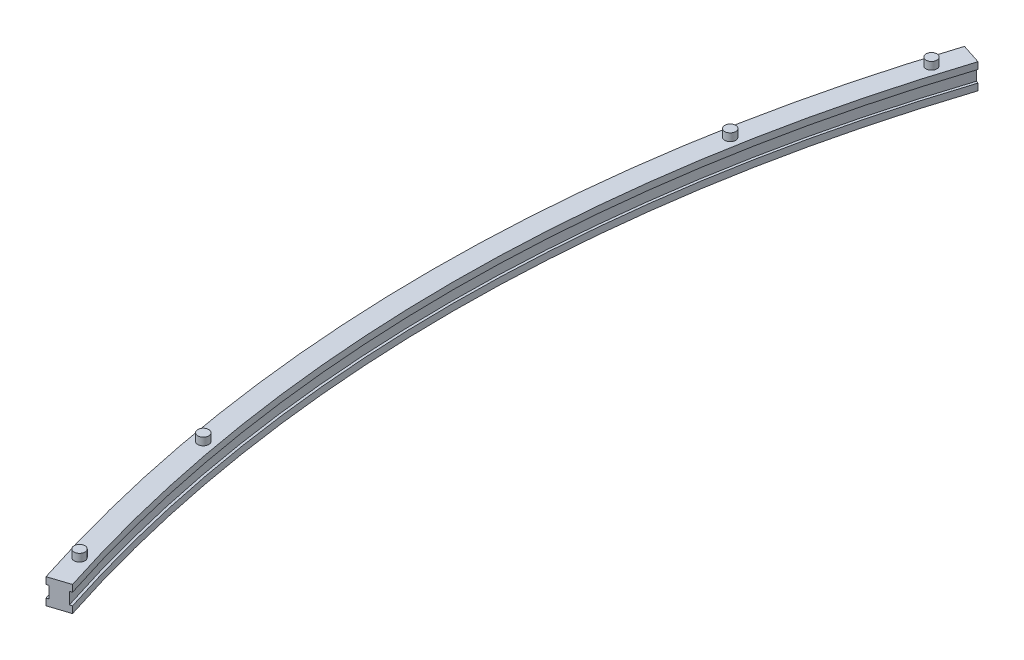
ISO-10303-21;
HEADER;
FILE_DESCRIPTION(('STEP AP214'),'2;1');
FILE_NAME('part.step','',(''),(''),'','','');
FILE_SCHEMA(('AUTOMOTIVE_DESIGN { 1 0 10303 214 1 1 1 1 }'));
ENDSEC;
DATA;
#1=APPLICATION_CONTEXT('core data for automotive mechanical design processes');
#2=APPLICATION_PROTOCOL_DEFINITION('international standard','automotive_design',2000,#1);
#3=PRODUCT_CONTEXT('',#1,'mechanical');
#4=PRODUCT('Part','Part','',(#3));
#5=PRODUCT_RELATED_PRODUCT_CATEGORY('part','',(#4));
#6=PRODUCT_DEFINITION_FORMATION('','',#4);
#7=PRODUCT_DEFINITION_CONTEXT('part definition',#1,'design');
#8=PRODUCT_DEFINITION('design','',#6,#7);
#9=PRODUCT_DEFINITION_SHAPE('','',#8);
#10=(LENGTH_UNIT() NAMED_UNIT(*) SI_UNIT(.MILLI.,.METRE.));
#11=(NAMED_UNIT(*) PLANE_ANGLE_UNIT() SI_UNIT($,.RADIAN.));
#12=(NAMED_UNIT(*) SI_UNIT($,.STERADIAN.) SOLID_ANGLE_UNIT());
#13=UNCERTAINTY_MEASURE_WITH_UNIT(LENGTH_MEASURE(1.E-05),#10,'distance_accuracy_value','');
#14=(GEOMETRIC_REPRESENTATION_CONTEXT(3) GLOBAL_UNCERTAINTY_ASSIGNED_CONTEXT((#13)) GLOBAL_UNIT_ASSIGNED_CONTEXT((#10,
#11,#12)) REPRESENTATION_CONTEXT('',''));
#15=CARTESIAN_POINT('',(0.,0.,0.));
#16=DIRECTION('',(0.,0.,1.));
#17=DIRECTION('',(1.,0.,0.));
#18=AXIS2_PLACEMENT_3D('',#15,#16,#17);
#19=CARTESIAN_POINT('',(0.,0.8,0.));
#20=DIRECTION('',(0.,1.,0.));
#21=DIRECTION('',(0.,0.,1.));
#22=AXIS2_PLACEMENT_3D('',#19,#20,#21);
#23=PLANE('',#22);
#24=CARTESIAN_POINT('',(0.,0.8,0.));
#25=DIRECTION('',(0.,1.,0.));
#26=DIRECTION('',(0.,0.,1.));
#27=AXIS2_PLACEMENT_3D('',#24,#25,#26);
#28=CIRCLE('',#27,176.305859736708);
#29=CARTESIAN_POINT('',(-167.676836763616,0.8,-54.4815068665299));
#30=VERTEX_POINT('',#29);
#31=CARTESIAN_POINT('',(-167.676836763616,0.8,54.4815068665286));
#32=VERTEX_POINT('',#31);
#33=EDGE_CURVE('E152',#30,#32,#28,.T.);
#34=ORIENTED_EDGE('',*,*,#33,.F.);
#35=DIRECTION('',(-0.951056516295151,0.,-0.309016994374955));
#36=VECTOR('',#35,1.);
#37=CARTESIAN_POINT('',(0.,0.8,0.));
#38=LINE('',#37,#36);
#39=CARTESIAN_POINT('',(-167.962153718504,0.8,-54.5742119648424));
#40=VERTEX_POINT('',#39);
#41=EDGE_CURVE('E182',#30,#40,#38,.T.);
#42=ORIENTED_EDGE('',*,*,#41,.T.);
#43=CARTESIAN_POINT('',(0.,0.8,0.));
#44=DIRECTION('',(0.,1.,0.));
#45=DIRECTION('',(0.,0.,1.));
#46=AXIS2_PLACEMENT_3D('',#43,#44,#45);
#47=CIRCLE('',#46,176.605859736708);
#48=CARTESIAN_POINT('',(-167.962153718504,0.8,54.5742119648409));
#49=VERTEX_POINT('',#48);
#50=EDGE_CURVE('E186',#40,#49,#47,.T.);
#51=ORIENTED_EDGE('',*,*,#50,.T.);
#52=DIRECTION('',(-0.951056516295154,0.,0.309016994374947));
#53=VECTOR('',#52,1.);
#54=CARTESIAN_POINT('',(0.,0.8,0.));
#55=LINE('',#54,#53);
#56=EDGE_CURVE('E52',#32,#49,#55,.T.);
#57=ORIENTED_EDGE('',*,*,#56,.F.);
#58=EDGE_LOOP('',(#34,#42,#51,#57));
#59=FACE_BOUND('',#58,.T.);
#60=ADVANCED_FACE('F35',(#59),#23,.T.);
#61=CARTESIAN_POINT('',(0.,0.8,0.));
#62=DIRECTION('',(0.,-1.,0.));
#63=DIRECTION('',(0.,0.,1.));
#64=AXIS2_PLACEMENT_3D('',#61,#62,#63);
#65=CIRCLE('',#64,174.405859736708);
#66=CARTESIAN_POINT('',(-165.869829382655,0.8,53.8943745772162));
#67=VERTEX_POINT('',#66);
#68=CARTESIAN_POINT('',(-165.869829382655,0.8,-53.8943745772176));
#69=VERTEX_POINT('',#68);
#70=EDGE_CURVE('E60',#67,#69,#65,.T.);
#71=ORIENTED_EDGE('',*,*,#70,.F.);
#72=CARTESIAN_POINT('',(-165.584512427766,0.8,53.8016694789036));
#73=VERTEX_POINT('',#72);
#74=EDGE_CURVE('E188',#73,#67,#55,.T.);
#75=ORIENTED_EDGE('',*,*,#74,.F.);
#76=CARTESIAN_POINT('',(0.,0.8,0.));
#77=DIRECTION('',(0.,1.,0.));
#78=DIRECTION('',(0.,0.,1.));
#79=AXIS2_PLACEMENT_3D('',#76,#77,#78);
#80=CIRCLE('',#79,174.105859736708);
#81=CARTESIAN_POINT('',(-165.584512427766,0.8,-53.801669478905));
#82=VERTEX_POINT('',#81);
#83=EDGE_CURVE('E179',#82,#73,#80,.T.);
#84=ORIENTED_EDGE('',*,*,#83,.F.);
#85=EDGE_CURVE('E184',#82,#69,#38,.T.);
#86=ORIENTED_EDGE('',*,*,#85,.T.);
#87=EDGE_LOOP('',(#71,#75,#84,#86));
#88=FACE_BOUND('',#87,.T.);
#89=ADVANCED_FACE('F269',(#88),#23,.T.);
#90=CARTESIAN_POINT('',(0.,0.8,0.));
#91=DIRECTION('',(0.,-1.,0.));
#92=DIRECTION('',(0.,0.,-1.));
#93=AXIS2_PLACEMENT_3D('',#90,#91,#92);
#94=CYLINDRICAL_SURFACE('',#93,174.105859736708);
#95=CARTESIAN_POINT('',(0.,0.,0.));
#96=DIRECTION('',(0.,1.,0.));
#97=DIRECTION('',(0.,0.,1.));
#98=AXIS2_PLACEMENT_3D('',#95,#96,#97);
#99=CIRCLE('',#98,174.105859736708);
#100=CARTESIAN_POINT('',(-165.584512427766,0.,-53.801669478905));
#101=VERTEX_POINT('',#100);
#102=CARTESIAN_POINT('',(-165.584512427766,0.,53.8016694789036));
#103=VERTEX_POINT('',#102);
#104=EDGE_CURVE('E178',#101,#103,#99,.T.);
#105=ORIENTED_EDGE('',*,*,#104,.F.);
#106=DIRECTION('',(0.,-1.,0.));
#107=VECTOR('',#106,1.);
#108=CARTESIAN_POINT('',(-165.584512427766,0.8,-53.801669478905));
#109=LINE('',#108,#107);
#110=EDGE_CURVE('E11',#82,#101,#109,.T.);
#111=ORIENTED_EDGE('',*,*,#110,.F.);
#112=ORIENTED_EDGE('',*,*,#83,.T.);
#113=DIRECTION('',(0.,-1.,0.));
#114=VECTOR('',#113,1.);
#115=CARTESIAN_POINT('',(-165.584512427766,0.8,53.8016694789036));
#116=LINE('',#115,#114);
#117=EDGE_CURVE('E190',#73,#103,#116,.T.);
#118=ORIENTED_EDGE('',*,*,#117,.T.);
#119=EDGE_LOOP('',(#105,#111,#112,#118));
#120=FACE_BOUND('',#119,.T.);
#121=ADVANCED_FACE('F37',(#120),#94,.F.);
#122=CARTESIAN_POINT('',(0.,0.8,0.));
#123=DIRECTION('',(-0.309016994374954,0.,0.951056516295151));
#124=DIRECTION('',(0.951056516295151,0.,0.309016994374954));
#125=AXIS2_PLACEMENT_3D('',#122,#123,#124);
#126=PLANE('',#125);
#127=DIRECTION('',(-0.951056516295151,0.,-0.309016994374955));
#128=VECTOR('',#127,1.);
#129=CARTESIAN_POINT('',(0.,0.,0.));
#130=LINE('',#129,#128);
#131=CARTESIAN_POINT('',(-167.962153718504,0.,-54.5742119648424));
#132=VERTEX_POINT('',#131);
#133=EDGE_CURVE('E193',#101,#132,#130,.T.);
#134=ORIENTED_EDGE('',*,*,#133,.T.);
#135=DIRECTION('',(0.,-1.,0.));
#136=VECTOR('',#135,1.);
#137=CARTESIAN_POINT('',(-167.962153718504,0.8,-54.5742119648424));
#138=LINE('',#137,#136);
#139=EDGE_CURVE('E44',#40,#132,#138,.T.);
#140=ORIENTED_EDGE('',*,*,#139,.F.);
#141=ORIENTED_EDGE('',*,*,#41,.F.);
#142=DIRECTION('',(0.,-1.,0.));
#143=VECTOR('',#142,1.);
#144=CARTESIAN_POINT('',(-167.676836763616,2.2,-54.48150686653));
#145=LINE('',#144,#143);
#146=CARTESIAN_POINT('',(-167.676836763616,2.2,-54.48150686653));
#147=VERTEX_POINT('',#146);
#148=EDGE_CURVE('E165',#147,#30,#145,.T.);
#149=ORIENTED_EDGE('',*,*,#148,.F.);
#150=DIRECTION('',(-0.951056516295152,0.,-0.309016994374953));
#151=VECTOR('',#150,1.);
#152=CARTESIAN_POINT('',(-165.584512427766,2.2,-53.8016694789049));
#153=LINE('',#152,#151);
#154=CARTESIAN_POINT('',(-167.962153718504,2.2,-54.5742119648423));
#155=VERTEX_POINT('',#154);
#156=EDGE_CURVE('E233',#147,#155,#153,.T.);
#157=ORIENTED_EDGE('',*,*,#156,.T.);
#158=DIRECTION('',(0.,-1.,0.));
#159=VECTOR('',#158,1.);
#160=CARTESIAN_POINT('',(-167.962153718504,3.,-54.5742119648423));
#161=LINE('',#160,#159);
#162=CARTESIAN_POINT('',(-167.962153718504,3.,-54.5742119648423));
#163=VERTEX_POINT('',#162);
#164=EDGE_CURVE('E134',#163,#155,#161,.T.);
#165=ORIENTED_EDGE('',*,*,#164,.F.);
#166=DIRECTION('',(-0.951056516295152,0.,-0.309016994374953));
#167=VECTOR('',#166,1.);
#168=CARTESIAN_POINT('',(-165.584512427766,3.,-53.8016694789049));
#169=LINE('',#168,#167);
#170=CARTESIAN_POINT('',(-165.584512427766,3.,-53.8016694789049));
#171=VERTEX_POINT('',#170);
#172=EDGE_CURVE('E126',#171,#163,#169,.T.);
#173=ORIENTED_EDGE('',*,*,#172,.F.);
#174=DIRECTION('',(0.,-1.,0.));
#175=VECTOR('',#174,1.);
#176=CARTESIAN_POINT('',(-165.584512427766,3.,-53.8016694789049));
#177=LINE('',#176,#175);
#178=CARTESIAN_POINT('',(-165.584512427766,2.2,-53.8016694789049));
#179=VERTEX_POINT('',#178);
#180=EDGE_CURVE('E131',#171,#179,#177,.T.);
#181=ORIENTED_EDGE('',*,*,#180,.T.);
#182=CARTESIAN_POINT('',(-165.869829382655,2.2,-53.8943745772175));
#183=VERTEX_POINT('',#182);
#184=EDGE_CURVE('E234',#179,#183,#153,.T.);
#185=ORIENTED_EDGE('',*,*,#184,.T.);
#186=DIRECTION('',(0.,-1.,0.));
#187=VECTOR('',#186,1.);
#188=CARTESIAN_POINT('',(-165.869829382655,2.2,-53.8943745772176));
#189=LINE('',#188,#187);
#190=EDGE_CURVE('E170',#183,#69,#189,.T.);
#191=ORIENTED_EDGE('',*,*,#190,.T.);
#192=ORIENTED_EDGE('',*,*,#85,.F.);
#193=ORIENTED_EDGE('',*,*,#110,.T.);
#194=EDGE_LOOP('',(#134,#140,#141,#149,#157,#165,#173,#181,#185,#191,#192,#193));
#195=FACE_BOUND('',#194,.T.);
#196=ADVANCED_FACE('F128',(#195),#126,.F.);
#197=CARTESIAN_POINT('',(0.,0.8,0.));
#198=DIRECTION('',(0.,-1.,0.));
#199=DIRECTION('',(0.,0.,-1.));
#200=AXIS2_PLACEMENT_3D('',#197,#198,#199);
#201=CYLINDRICAL_SURFACE('',#200,176.605859736708);
#202=CARTESIAN_POINT('',(0.,0.,0.));
#203=DIRECTION('',(0.,1.,0.));
#204=DIRECTION('',(0.,0.,1.));
#205=AXIS2_PLACEMENT_3D('',#202,#203,#204);
#206=CIRCLE('',#205,176.605859736708);
#207=CARTESIAN_POINT('',(-167.962153718504,0.,54.5742119648409));
#208=VERTEX_POINT('',#207);
#209=EDGE_CURVE('E195',#132,#208,#206,.T.);
#210=ORIENTED_EDGE('',*,*,#209,.T.);
#211=DIRECTION('',(0.,-1.,0.));
#212=VECTOR('',#211,1.);
#213=CARTESIAN_POINT('',(-167.962153718504,0.8,54.5742119648409));
#214=LINE('',#213,#212);
#215=EDGE_CURVE('E201',#49,#208,#214,.T.);
#216=ORIENTED_EDGE('',*,*,#215,.F.);
#217=ORIENTED_EDGE('',*,*,#50,.F.);
#218=ORIENTED_EDGE('',*,*,#139,.T.);
#219=EDGE_LOOP('',(#210,#216,#217,#218));
#220=FACE_BOUND('',#219,.T.);
#221=ADVANCED_FACE('F260',(#220),#201,.T.);
#222=CARTESIAN_POINT('',(0.,0.8,0.));
#223=DIRECTION('',(0.309016994374947,0.,0.951056516295154));
#224=DIRECTION('',(0.951056516295154,0.,-0.309016994374947));
#225=AXIS2_PLACEMENT_3D('',#222,#223,#224);
#226=PLANE('',#225);
#227=DIRECTION('',(-0.951056516295154,0.,0.309016994374947));
#228=VECTOR('',#227,1.);
#229=CARTESIAN_POINT('',(0.,0.,0.));
#230=LINE('',#229,#228);
#231=EDGE_CURVE('E183',#103,#208,#230,.T.);
#232=ORIENTED_EDGE('',*,*,#231,.F.);
#233=ORIENTED_EDGE('',*,*,#117,.F.);
#234=ORIENTED_EDGE('',*,*,#74,.T.);
#235=DIRECTION('',(0.,-1.,0.));
#236=VECTOR('',#235,1.);
#237=CARTESIAN_POINT('',(-165.869829382655,2.2,53.8943745772163));
#238=LINE('',#237,#236);
#239=CARTESIAN_POINT('',(-165.869829382655,2.2,53.8943745772163));
#240=VERTEX_POINT('',#239);
#241=EDGE_CURVE('E173',#240,#67,#238,.T.);
#242=ORIENTED_EDGE('',*,*,#241,.F.);
#243=DIRECTION('',(0.951056516295151,0.,-0.309016994374954));
#244=VECTOR('',#243,1.);
#245=CARTESIAN_POINT('',(-167.962153718504,2.2,54.5742119648409));
#246=LINE('',#245,#244);
#247=CARTESIAN_POINT('',(-165.584512427766,2.2,53.8016694789036));
#248=VERTEX_POINT('',#247);
#249=EDGE_CURVE('E238',#240,#248,#246,.T.);
#250=ORIENTED_EDGE('',*,*,#249,.T.);
#251=DIRECTION('',(0.,-1.,0.));
#252=VECTOR('',#251,1.);
#253=CARTESIAN_POINT('',(-165.584512427766,3.,53.8016694789036));
#254=LINE('',#253,#252);
#255=CARTESIAN_POINT('',(-165.584512427766,3.,53.8016694789036));
#256=VERTEX_POINT('',#255);
#257=EDGE_CURVE('E231',#256,#248,#254,.T.);
#258=ORIENTED_EDGE('',*,*,#257,.F.);
#259=DIRECTION('',(0.951056516295151,0.,-0.309016994374954));
#260=VECTOR('',#259,1.);
#261=CARTESIAN_POINT('',(-167.962153718504,3.,54.5742119648409));
#262=LINE('',#261,#260);
#263=CARTESIAN_POINT('',(-167.962153718504,3.,54.574211964841));
#264=VERTEX_POINT('',#263);
#265=EDGE_CURVE('E143',#264,#256,#262,.T.);
#266=ORIENTED_EDGE('',*,*,#265,.F.);
#267=DIRECTION('',(0.,-1.,0.));
#268=VECTOR('',#267,1.);
#269=CARTESIAN_POINT('',(-167.962153718504,3.,54.574211964841));
#270=LINE('',#269,#268);
#271=CARTESIAN_POINT('',(-167.962153718504,2.2,54.574211964841));
#272=VERTEX_POINT('',#271);
#273=EDGE_CURVE('E156',#264,#272,#270,.T.);
#274=ORIENTED_EDGE('',*,*,#273,.T.);
#275=CARTESIAN_POINT('',(-167.676836763616,2.2,54.4815068665285));
#276=VERTEX_POINT('',#275);
#277=EDGE_CURVE('E147',#272,#276,#246,.T.);
#278=ORIENTED_EDGE('',*,*,#277,.T.);
#279=DIRECTION('',(0.,-1.,0.));
#280=VECTOR('',#279,1.);
#281=CARTESIAN_POINT('',(-167.676836763616,2.2,54.4815068665285));
#282=LINE('',#281,#280);
#283=EDGE_CURVE('E176',#276,#32,#282,.T.);
#284=ORIENTED_EDGE('',*,*,#283,.T.);
#285=ORIENTED_EDGE('',*,*,#56,.T.);
#286=ORIENTED_EDGE('',*,*,#215,.T.);
#287=EDGE_LOOP('',(#232,#233,#234,#242,#250,#258,#266,#274,#278,#284,#285,#286));
#288=FACE_BOUND('',#287,.T.);
#289=ADVANCED_FACE('F246',(#288),#226,.T.);
#290=CARTESIAN_POINT('',(0.,0.,0.));
#291=DIRECTION('',(0.,1.,0.));
#292=DIRECTION('',(0.,0.,1.));
#293=AXIS2_PLACEMENT_3D('',#290,#291,#292);
#294=PLANE('',#293);
#295=ORIENTED_EDGE('',*,*,#104,.T.);
#296=ORIENTED_EDGE('',*,*,#231,.T.);
#297=ORIENTED_EDGE('',*,*,#209,.F.);
#298=ORIENTED_EDGE('',*,*,#133,.F.);
#299=EDGE_LOOP('',(#295,#296,#297,#298));
#300=FACE_BOUND('',#299,.T.);
#301=ADVANCED_FACE('F264',(#300),#294,.F.);
#302=CARTESIAN_POINT('',(0.,2.2,0.));
#303=DIRECTION('',(0.,-1.,0.));
#304=DIRECTION('',(0.,0.,-1.));
#305=AXIS2_PLACEMENT_3D('',#302,#303,#304);
#306=CYLINDRICAL_SURFACE('',#305,176.305859736708);
#307=ORIENTED_EDGE('',*,*,#33,.T.);
#308=ORIENTED_EDGE('',*,*,#283,.F.);
#309=CARTESIAN_POINT('',(0.,2.2,0.));
#310=DIRECTION('',(0.,1.,0.));
#311=DIRECTION('',(0.,0.,1.));
#312=AXIS2_PLACEMENT_3D('',#309,#310,#311);
#313=CIRCLE('',#312,176.305859736708);
#314=EDGE_CURVE('E160',#147,#276,#313,.T.);
#315=ORIENTED_EDGE('',*,*,#314,.F.);
#316=ORIENTED_EDGE('',*,*,#148,.T.);
#317=EDGE_LOOP('',(#307,#308,#315,#316));
#318=FACE_BOUND('',#317,.T.);
#319=ADVANCED_FACE('F254',(#318),#306,.T.);
#320=CARTESIAN_POINT('',(0.,2.2,0.));
#321=DIRECTION('',(0.,-1.,0.));
#322=DIRECTION('',(0.,0.,-1.));
#323=AXIS2_PLACEMENT_3D('',#320,#321,#322);
#324=CYLINDRICAL_SURFACE('',#323,174.405859736708);
#325=ORIENTED_EDGE('',*,*,#70,.T.);
#326=ORIENTED_EDGE('',*,*,#190,.F.);
#327=CARTESIAN_POINT('',(0.,2.2,0.));
#328=DIRECTION('',(0.,-1.,0.));
#329=DIRECTION('',(0.,0.,1.));
#330=AXIS2_PLACEMENT_3D('',#327,#328,#329);
#331=CIRCLE('',#330,174.405859736708);
#332=EDGE_CURVE('E163',#240,#183,#331,.T.);
#333=ORIENTED_EDGE('',*,*,#332,.F.);
#334=ORIENTED_EDGE('',*,*,#241,.T.);
#335=EDGE_LOOP('',(#325,#326,#333,#334));
#336=FACE_BOUND('',#335,.T.);
#337=ADVANCED_FACE('F310',(#336),#324,.F.);
#338=CARTESIAN_POINT('',(0.,2.2,0.));
#339=DIRECTION('',(0.,1.,0.));
#340=DIRECTION('',(0.,0.,1.));
#341=AXIS2_PLACEMENT_3D('',#338,#339,#340);
#342=PLANE('',#341);
#343=ORIENTED_EDGE('',*,*,#156,.F.);
#344=ORIENTED_EDGE('',*,*,#314,.T.);
#345=ORIENTED_EDGE('',*,*,#277,.F.);
#346=CARTESIAN_POINT('',(0.,2.2,0.));
#347=DIRECTION('',(0.,1.,0.));
#348=DIRECTION('',(0.,0.,1.));
#349=AXIS2_PLACEMENT_3D('',#346,#347,#348);
#350=CIRCLE('',#349,176.605859736708);
#351=EDGE_CURVE('E236',#155,#272,#350,.T.);
#352=ORIENTED_EDGE('',*,*,#351,.F.);
#353=EDGE_LOOP('',(#343,#344,#345,#352));
#354=FACE_BOUND('',#353,.T.);
#355=ADVANCED_FACE('F251',(#354),#342,.F.);
#356=ORIENTED_EDGE('',*,*,#249,.F.);
#357=ORIENTED_EDGE('',*,*,#332,.T.);
#358=ORIENTED_EDGE('',*,*,#184,.F.);
#359=CARTESIAN_POINT('',(0.,2.2,0.));
#360=DIRECTION('',(0.,-1.,0.));
#361=DIRECTION('',(0.,0.,1.));
#362=AXIS2_PLACEMENT_3D('',#359,#360,#361);
#363=CIRCLE('',#362,174.105859736708);
#364=EDGE_CURVE('E151',#248,#179,#363,.T.);
#365=ORIENTED_EDGE('',*,*,#364,.F.);
#366=EDGE_LOOP('',(#356,#357,#358,#365));
#367=FACE_BOUND('',#366,.T.);
#368=ADVANCED_FACE('F322',(#367),#342,.F.);
#369=CARTESIAN_POINT('',(0.,3.,0.));
#370=DIRECTION('',(0.,-1.,0.));
#371=DIRECTION('',(0.,0.,-1.));
#372=AXIS2_PLACEMENT_3D('',#369,#370,#371);
#373=CYLINDRICAL_SURFACE('',#372,174.105859736708);
#374=ORIENTED_EDGE('',*,*,#364,.T.);
#375=ORIENTED_EDGE('',*,*,#180,.F.);
#376=CARTESIAN_POINT('',(0.,3.,0.));
#377=DIRECTION('',(0.,-1.,0.));
#378=DIRECTION('',(0.,0.,1.));
#379=AXIS2_PLACEMENT_3D('',#376,#377,#378);
#380=CIRCLE('',#379,174.105859736708);
#381=EDGE_CURVE('E138',#256,#171,#380,.T.);
#382=ORIENTED_EDGE('',*,*,#381,.F.);
#383=ORIENTED_EDGE('',*,*,#257,.T.);
#384=EDGE_LOOP('',(#374,#375,#382,#383));
#385=FACE_BOUND('',#384,.T.);
#386=ADVANCED_FACE('F149',(#385),#373,.F.);
#387=CARTESIAN_POINT('',(0.,3.,0.));
#388=DIRECTION('',(0.,-1.,0.));
#389=DIRECTION('',(0.,0.,-1.));
#390=AXIS2_PLACEMENT_3D('',#387,#388,#389);
#391=CYLINDRICAL_SURFACE('',#390,176.605859736708);
#392=ORIENTED_EDGE('',*,*,#351,.T.);
#393=ORIENTED_EDGE('',*,*,#273,.F.);
#394=CARTESIAN_POINT('',(0.,3.,0.));
#395=DIRECTION('',(0.,1.,0.));
#396=DIRECTION('',(0.,0.,1.));
#397=AXIS2_PLACEMENT_3D('',#394,#395,#396);
#398=CIRCLE('',#397,176.605859736708);
#399=EDGE_CURVE('E137',#163,#264,#398,.T.);
#400=ORIENTED_EDGE('',*,*,#399,.F.);
#401=ORIENTED_EDGE('',*,*,#164,.T.);
#402=EDGE_LOOP('',(#392,#393,#400,#401));
#403=FACE_BOUND('',#402,.T.);
#404=ADVANCED_FACE('F335',(#403),#391,.T.);
#405=CARTESIAN_POINT('',(0.,3.,0.));
#406=DIRECTION('',(0.,1.,0.));
#407=DIRECTION('',(0.,0.,1.));
#408=AXIS2_PLACEMENT_3D('',#405,#406,#407);
#409=PLANE('',#408);
#410=CARTESIAN_POINT('',(-172.538,3.,-31.31));
#411=DIRECTION('',(0.,1.,0.));
#412=DIRECTION('',(0.,0.,1.));
#413=AXIS2_PLACEMENT_3D('',#410,#411,#412);
#414=CIRCLE('',#413,0.650000000000019);
#415=CARTESIAN_POINT('',(-172.538,3.,-30.66));
#416=VERTEX_POINT('',#415);
#417=EDGE_CURVE('E39',#416,#416,#414,.F.);
#418=ORIENTED_EDGE('',*,*,#417,.T.);
#419=EDGE_LOOP('',(#418));
#420=FACE_BOUND('',#419,.T.);
#421=CARTESIAN_POINT('',(-167.932,3.,50.621));
#422=DIRECTION('',(0.,1.,0.));
#423=DIRECTION('',(0.,0.,1.));
#424=AXIS2_PLACEMENT_3D('',#421,#422,#423);
#425=CIRCLE('',#424,0.650000000000019);
#426=CARTESIAN_POINT('',(-167.932,3.,51.271));
#427=VERTEX_POINT('',#426);
#428=EDGE_CURVE('E212',#427,#427,#425,.F.);
#429=ORIENTED_EDGE('',*,*,#428,.T.);
#430=EDGE_LOOP('',(#429));
#431=FACE_BOUND('',#430,.T.);
#432=CARTESIAN_POINT('',(-167.932,3.,-50.621));
#433=DIRECTION('',(0.,1.,0.));
#434=DIRECTION('',(0.,0.,1.));
#435=AXIS2_PLACEMENT_3D('',#432,#433,#434);
#436=CIRCLE('',#435,0.650000000000019);
#437=CARTESIAN_POINT('',(-167.932,3.,-49.971));
#438=VERTEX_POINT('',#437);
#439=EDGE_CURVE('E209',#438,#438,#436,.F.);
#440=ORIENTED_EDGE('',*,*,#439,.T.);
#441=EDGE_LOOP('',(#440));
#442=FACE_BOUND('',#441,.T.);
#443=CARTESIAN_POINT('',(-172.538,3.,31.31));
#444=DIRECTION('',(0.,1.,0.));
#445=DIRECTION('',(0.,0.,1.));
#446=AXIS2_PLACEMENT_3D('',#443,#444,#445);
#447=CIRCLE('',#446,0.650000000000019);
#448=CARTESIAN_POINT('',(-172.538,3.,31.96));
#449=VERTEX_POINT('',#448);
#450=EDGE_CURVE('E205',#449,#449,#447,.F.);
#451=ORIENTED_EDGE('',*,*,#450,.T.);
#452=EDGE_LOOP('',(#451));
#453=FACE_BOUND('',#452,.T.);
#454=ORIENTED_EDGE('',*,*,#381,.T.);
#455=ORIENTED_EDGE('',*,*,#172,.T.);
#456=ORIENTED_EDGE('',*,*,#399,.T.);
#457=ORIENTED_EDGE('',*,*,#265,.T.);
#458=EDGE_LOOP('',(#454,#455,#456,#457));
#459=FACE_BOUND('',#458,.T.);
#460=ADVANCED_FACE('F141',(#420,#431,#442,#453,#459),#409,.T.);
#461=CARTESIAN_POINT('',(-172.538,3.9,31.31));
#462=DIRECTION('',(0.,-1.,0.));
#463=DIRECTION('',(0.,0.,-1.));
#464=AXIS2_PLACEMENT_3D('',#461,#462,#463);
#465=CYLINDRICAL_SURFACE('',#464,0.650000000000019);
#466=ORIENTED_EDGE('',*,*,#450,.F.);
#467=EDGE_LOOP('',(#466));
#468=FACE_BOUND('',#467,.T.);
#469=CARTESIAN_POINT('',(-172.538,3.9,31.31));
#470=DIRECTION('',(0.,1.,0.));
#471=DIRECTION('',(0.,0.,1.));
#472=AXIS2_PLACEMENT_3D('',#469,#470,#471);
#473=CIRCLE('',#472,0.650000000000019);
#474=CARTESIAN_POINT('',(-172.538,3.9,31.96));
#475=VERTEX_POINT('',#474);
#476=EDGE_CURVE('E208',#475,#475,#473,.T.);
#477=ORIENTED_EDGE('',*,*,#476,.F.);
#478=EDGE_LOOP('',(#477));
#479=FACE_BOUND('',#478,.T.);
#480=ADVANCED_FACE('F346',(#468,#479),#465,.T.);
#481=CARTESIAN_POINT('',(0.,3.9,0.));
#482=DIRECTION('',(0.,1.,0.));
#483=DIRECTION('',(0.,0.,1.));
#484=AXIS2_PLACEMENT_3D('',#481,#482,#483);
#485=PLANE('',#484);
#486=ORIENTED_EDGE('',*,*,#476,.T.);
#487=EDGE_LOOP('',(#486));
#488=FACE_BOUND('',#487,.T.);
#489=ADVANCED_FACE('F354',(#488),#485,.T.);
#490=CARTESIAN_POINT('',(-167.932,3.9,-50.621));
#491=DIRECTION('',(0.,-1.,0.));
#492=DIRECTION('',(0.,0.,-1.));
#493=AXIS2_PLACEMENT_3D('',#490,#491,#492);
#494=CYLINDRICAL_SURFACE('',#493,0.650000000000019);
#495=ORIENTED_EDGE('',*,*,#439,.F.);
#496=EDGE_LOOP('',(#495));
#497=FACE_BOUND('',#496,.T.);
#498=CARTESIAN_POINT('',(-167.932,3.9,-50.621));
#499=DIRECTION('',(0.,1.,0.));
#500=DIRECTION('',(0.,0.,1.));
#501=AXIS2_PLACEMENT_3D('',#498,#499,#500);
#502=CIRCLE('',#501,0.650000000000019);
#503=CARTESIAN_POINT('',(-167.932,3.9,-49.971));
#504=VERTEX_POINT('',#503);
#505=EDGE_CURVE('E211',#504,#504,#502,.T.);
#506=ORIENTED_EDGE('',*,*,#505,.F.);
#507=EDGE_LOOP('',(#506));
#508=FACE_BOUND('',#507,.T.);
#509=ADVANCED_FACE('F362',(#497,#508),#494,.T.);
#510=CARTESIAN_POINT('',(0.,3.9,0.));
#511=DIRECTION('',(0.,1.,0.));
#512=DIRECTION('',(0.,0.,1.));
#513=AXIS2_PLACEMENT_3D('',#510,#511,#512);
#514=PLANE('',#513);
#515=ORIENTED_EDGE('',*,*,#505,.T.);
#516=EDGE_LOOP('',(#515));
#517=FACE_BOUND('',#516,.T.);
#518=ADVANCED_FACE('F370',(#517),#514,.T.);
#519=CARTESIAN_POINT('',(-167.932,3.9,50.621));
#520=DIRECTION('',(0.,-1.,0.));
#521=DIRECTION('',(0.,0.,-1.));
#522=AXIS2_PLACEMENT_3D('',#519,#520,#521);
#523=CYLINDRICAL_SURFACE('',#522,0.650000000000019);
#524=ORIENTED_EDGE('',*,*,#428,.F.);
#525=EDGE_LOOP('',(#524));
#526=FACE_BOUND('',#525,.T.);
#527=CARTESIAN_POINT('',(-167.932,3.9,50.621));
#528=DIRECTION('',(0.,1.,0.));
#529=DIRECTION('',(0.,0.,1.));
#530=AXIS2_PLACEMENT_3D('',#527,#528,#529);
#531=CIRCLE('',#530,0.650000000000019);
#532=CARTESIAN_POINT('',(-167.932,3.9,51.271));
#533=VERTEX_POINT('',#532);
#534=EDGE_CURVE('E214',#533,#533,#531,.T.);
#535=ORIENTED_EDGE('',*,*,#534,.F.);
#536=EDGE_LOOP('',(#535));
#537=FACE_BOUND('',#536,.T.);
#538=ADVANCED_FACE('F378',(#526,#537),#523,.T.);
#539=CARTESIAN_POINT('',(-167.932,3.9,50.621));
#540=DIRECTION('',(0.,1.,0.));
#541=DIRECTION('',(0.,0.,1.));
#542=AXIS2_PLACEMENT_3D('',#539,#540,#541);
#543=PLANE('',#542);
#544=ORIENTED_EDGE('',*,*,#534,.T.);
#545=EDGE_LOOP('',(#544));
#546=FACE_BOUND('',#545,.T.);
#547=ADVANCED_FACE('F386',(#546),#543,.T.);
#548=CARTESIAN_POINT('',(-172.538,3.9,-31.31));
#549=DIRECTION('',(0.,-1.,0.));
#550=DIRECTION('',(0.,0.,-1.));
#551=AXIS2_PLACEMENT_3D('',#548,#549,#550);
#552=CYLINDRICAL_SURFACE('',#551,0.650000000000019);
#553=ORIENTED_EDGE('',*,*,#417,.F.);
#554=EDGE_LOOP('',(#553));
#555=FACE_BOUND('',#554,.T.);
#556=CARTESIAN_POINT('',(-172.538,3.9,-31.31));
#557=DIRECTION('',(0.,1.,0.));
#558=DIRECTION('',(0.,0.,1.));
#559=AXIS2_PLACEMENT_3D('',#556,#557,#558);
#560=CIRCLE('',#559,0.650000000000019);
#561=CARTESIAN_POINT('',(-172.538,3.9,-30.66));
#562=VERTEX_POINT('',#561);
#563=EDGE_CURVE('E224',#562,#562,#560,.T.);
#564=ORIENTED_EDGE('',*,*,#563,.F.);
#565=EDGE_LOOP('',(#564));
#566=FACE_BOUND('',#565,.T.);
#567=ADVANCED_FACE('F394',(#555,#566),#552,.T.);
#568=CARTESIAN_POINT('',(-172.538,3.9,-31.31));
#569=DIRECTION('',(0.,1.,0.));
#570=DIRECTION('',(0.,0.,1.));
#571=AXIS2_PLACEMENT_3D('',#568,#569,#570);
#572=PLANE('',#571);
#573=ORIENTED_EDGE('',*,*,#563,.T.);
#574=EDGE_LOOP('',(#573));
#575=FACE_BOUND('',#574,.T.);
#576=ADVANCED_FACE('F401',(#575),#572,.T.);
#577=CLOSED_SHELL('',(#60,#89,#121,#196,#221,#289,#301,#319,#337,#355,#368,#386,#404,#460,#480,
#489,#509,#518,#538,#547,#567,#576));
#578=MANIFOLD_SOLID_BREP('B2',#577);
#579=ADVANCED_BREP_SHAPE_REPRESENTATION('',(#18,#578),#14);
#580=SHAPE_DEFINITION_REPRESENTATION(#9,#579);
ENDSEC;
END-ISO-10303-21;
